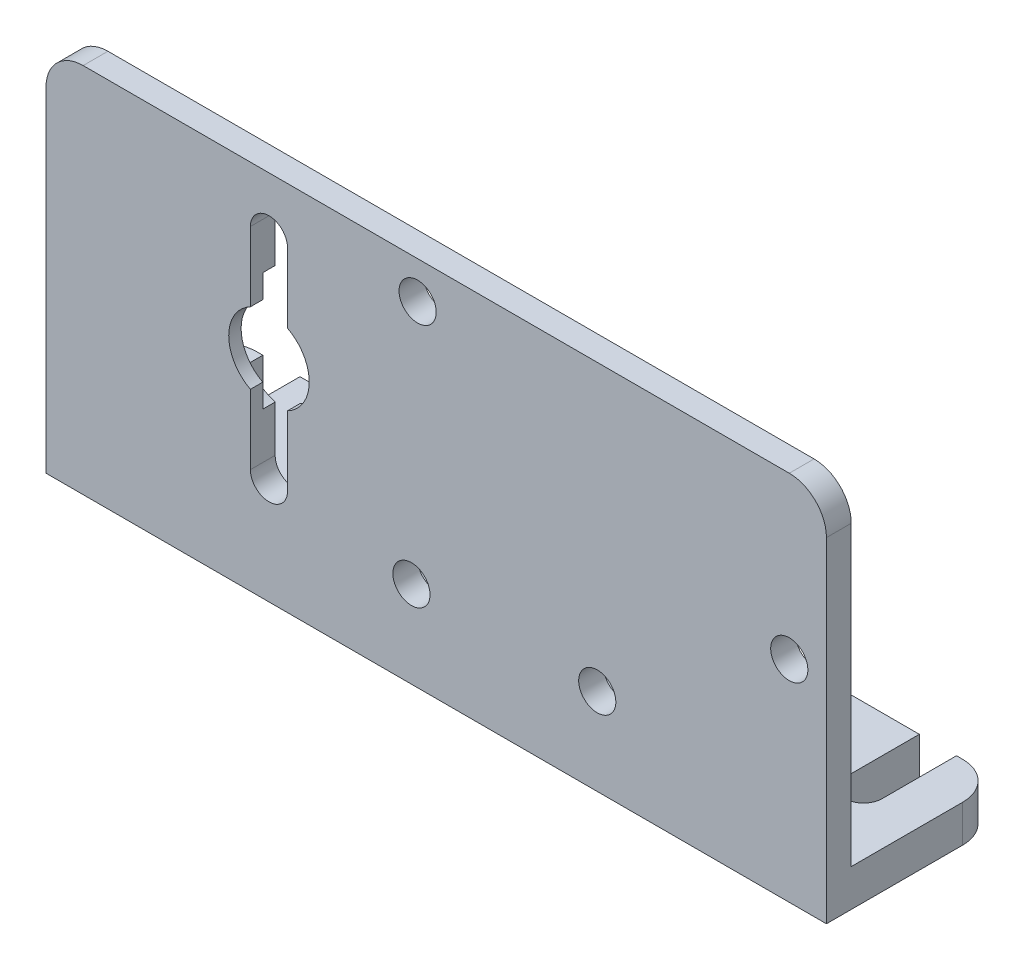
ISO-10303-21;
HEADER;
FILE_DESCRIPTION(('STEP AP214'),'2;1');
FILE_NAME('part.step','',(''),(''),'','','');
FILE_SCHEMA(('AUTOMOTIVE_DESIGN { 1 0 10303 214 1 1 1 1 }'));
ENDSEC;
DATA;
#1=APPLICATION_CONTEXT('core data for automotive mechanical design processes');
#2=APPLICATION_PROTOCOL_DEFINITION('international standard','automotive_design',2000,#1);
#3=PRODUCT_CONTEXT('',#1,'mechanical');
#4=PRODUCT('Part','Part','',(#3));
#5=PRODUCT_RELATED_PRODUCT_CATEGORY('part','',(#4));
#6=PRODUCT_DEFINITION_FORMATION('','',#4);
#7=PRODUCT_DEFINITION_CONTEXT('part definition',#1,'design');
#8=PRODUCT_DEFINITION('design','',#6,#7);
#9=PRODUCT_DEFINITION_SHAPE('','',#8);
#10=(LENGTH_UNIT() NAMED_UNIT(*) SI_UNIT(.MILLI.,.METRE.));
#11=(NAMED_UNIT(*) PLANE_ANGLE_UNIT() SI_UNIT($,.RADIAN.));
#12=(NAMED_UNIT(*) SI_UNIT($,.STERADIAN.) SOLID_ANGLE_UNIT());
#13=UNCERTAINTY_MEASURE_WITH_UNIT(LENGTH_MEASURE(1.E-05),#10,'distance_accuracy_value','');
#14=(GEOMETRIC_REPRESENTATION_CONTEXT(3) GLOBAL_UNCERTAINTY_ASSIGNED_CONTEXT((#13)) GLOBAL_UNIT_ASSIGNED_CONTEXT((#10,
#11,#12)) REPRESENTATION_CONTEXT('',''));
#15=CARTESIAN_POINT('',(0.,0.,0.));
#16=DIRECTION('',(0.,0.,1.));
#17=DIRECTION('',(1.,0.,0.));
#18=AXIS2_PLACEMENT_3D('',#15,#16,#17);
#19=CARTESIAN_POINT('',(-12.,10.5,-12.0000000000001));
#20=DIRECTION('',(1.,0.,0.));
#21=DIRECTION('',(0.,1.,0.));
#22=AXIS2_PLACEMENT_3D('',#19,#20,#21);
#23=PLANE('',#22);
#24=DIRECTION('',(0.,1.,0.));
#25=VECTOR('',#24,1.);
#26=CARTESIAN_POINT('',(-12.,10.5,1.99999999999995));
#27=LINE('',#26,#25);
#28=CARTESIAN_POINT('',(-12.,-6.49999999999998,1.99999999999995));
#29=VERTEX_POINT('',#28);
#30=CARTESIAN_POINT('',(-12.,-0.88314064866768,1.99999999999995));
#31=VERTEX_POINT('',#30);
#32=EDGE_CURVE('E274',#29,#31,#27,.T.);
#33=ORIENTED_EDGE('',*,*,#32,.T.);
#34=DIRECTION('',(0.,0.,-1.));
#35=VECTOR('',#34,1.);
#36=CARTESIAN_POINT('',(-12.,-0.88314064866768,1.99999999999995));
#37=LINE('',#36,#35);
#38=CARTESIAN_POINT('',(-12.,-0.88314064866768,0.999999999999945));
#39=VERTEX_POINT('',#38);
#40=EDGE_CURVE('E551',#31,#39,#37,.T.);
#41=ORIENTED_EDGE('',*,*,#40,.T.);
#42=DIRECTION('',(0.,-1.,0.));
#43=VECTOR('',#42,1.);
#44=CARTESIAN_POINT('',(-12.,10.5,0.999999999999945));
#45=LINE('',#44,#43);
#46=CARTESIAN_POINT('',(-12.,-2.76969600708471,0.999999999999945));
#47=VERTEX_POINT('',#46);
#48=EDGE_CURVE('E546',#39,#47,#45,.T.);
#49=ORIENTED_EDGE('',*,*,#48,.T.);
#50=DIRECTION('',(0.,0.,-1.));
#51=VECTOR('',#50,1.);
#52=CARTESIAN_POINT('',(-12.,-2.76969600708471,0.999999999999945));
#53=LINE('',#52,#51);
#54=CARTESIAN_POINT('',(-12.,-2.76969600708471,0.));
#55=VERTEX_POINT('',#54);
#56=EDGE_CURVE('E531',#55,#47,#53,.F.);
#57=ORIENTED_EDGE('',*,*,#56,.F.);
#58=DIRECTION('',(0.,-1.,0.));
#59=VECTOR('',#58,1.);
#60=CARTESIAN_POINT('',(-12.,0.,0.));
#61=LINE('',#60,#59);
#62=CARTESIAN_POINT('',(-12.,-6.49999999999998,0.));
#63=VERTEX_POINT('',#62);
#64=EDGE_CURVE('E300',#55,#63,#61,.T.);
#65=ORIENTED_EDGE('',*,*,#64,.T.);
#66=DIRECTION('',(0.,0.,1.));
#67=VECTOR('',#66,1.);
#68=CARTESIAN_POINT('',(-12.,-6.49999999999998,-12.0000000000001));
#69=LINE('',#68,#67);
#70=EDGE_CURVE('E283',#63,#29,#69,.T.);
#71=ORIENTED_EDGE('',*,*,#70,.T.);
#72=EDGE_LOOP('',(#33,#41,#49,#57,#65,#71));
#73=FACE_BOUND('',#72,.T.);
#74=ADVANCED_FACE('F39',(#73),#23,.F.);
#75=CARTESIAN_POINT('',(-15.,10.5,-12.));
#76=DIRECTION('',(-1.,0.,0.));
#77=DIRECTION('',(0.,-1.,0.));
#78=AXIS2_PLACEMENT_3D('',#75,#76,#77);
#79=PLANE('',#78);
#80=DIRECTION('',(0.,-1.,0.));
#81=VECTOR('',#80,1.);
#82=CARTESIAN_POINT('',(-15.,10.5,1.99999999999995));
#83=LINE('',#82,#81);
#84=CARTESIAN_POINT('',(-15.,10.5,1.99999999999995));
#85=VERTEX_POINT('',#84);
#86=CARTESIAN_POINT('',(-15.,4.88314064866771,1.99999999999995));
#87=VERTEX_POINT('',#86);
#88=EDGE_CURVE('E251',#85,#87,#83,.T.);
#89=ORIENTED_EDGE('',*,*,#88,.T.);
#90=DIRECTION('',(0.,0.,-1.));
#91=VECTOR('',#90,1.);
#92=CARTESIAN_POINT('',(-15.,4.88314064866771,1.99999999999995));
#93=LINE('',#92,#91);
#94=CARTESIAN_POINT('',(-15.,4.88314064866771,0.999999999999945));
#95=VERTEX_POINT('',#94);
#96=EDGE_CURVE('E234',#87,#95,#93,.T.);
#97=ORIENTED_EDGE('',*,*,#96,.T.);
#98=DIRECTION('',(0.,1.,0.));
#99=VECTOR('',#98,1.);
#100=CARTESIAN_POINT('',(-15.,10.5,0.999999999999945));
#101=LINE('',#100,#99);
#102=CARTESIAN_POINT('',(-15.,6.76969600708474,0.999999999999945));
#103=VERTEX_POINT('',#102);
#104=EDGE_CURVE('E485',#95,#103,#101,.T.);
#105=ORIENTED_EDGE('',*,*,#104,.T.);
#106=DIRECTION('',(0.,0.,-1.));
#107=VECTOR('',#106,1.);
#108=CARTESIAN_POINT('',(-15.,6.76969600708474,0.999999999999945));
#109=LINE('',#108,#107);
#110=CARTESIAN_POINT('',(-15.,6.76969600708474,0.));
#111=VERTEX_POINT('',#110);
#112=EDGE_CURVE('E48',#111,#103,#109,.F.);
#113=ORIENTED_EDGE('',*,*,#112,.F.);
#114=DIRECTION('',(0.,1.,0.));
#115=VECTOR('',#114,1.);
#116=CARTESIAN_POINT('',(-15.,0.,0.));
#117=LINE('',#116,#115);
#118=CARTESIAN_POINT('',(-15.,10.5,0.));
#119=VERTEX_POINT('',#118);
#120=EDGE_CURVE('E282',#111,#119,#117,.T.);
#121=ORIENTED_EDGE('',*,*,#120,.T.);
#122=DIRECTION('',(0.,0.,1.));
#123=VECTOR('',#122,1.);
#124=CARTESIAN_POINT('',(-15.,10.5,-12.));
#125=LINE('',#124,#123);
#126=EDGE_CURVE('E260',#119,#85,#125,.T.);
#127=ORIENTED_EDGE('',*,*,#126,.T.);
#128=EDGE_LOOP('',(#89,#97,#105,#113,#121,#127));
#129=FACE_BOUND('',#128,.T.);
#130=ADVANCED_FACE('F258',(#129),#79,.F.);
#131=CARTESIAN_POINT('',(-12.,6.76969600708474,0.999999999999945));
#132=VERTEX_POINT('',#131);
#133=CARTESIAN_POINT('',(-12.,4.88314064866771,0.999999999999945));
#134=VERTEX_POINT('',#133);
#135=EDGE_CURVE('E541',#132,#134,#45,.T.);
#136=ORIENTED_EDGE('',*,*,#135,.T.);
#137=DIRECTION('',(0.,0.,-1.));
#138=VECTOR('',#137,1.);
#139=CARTESIAN_POINT('',(-12.,4.88314064866771,1.99999999999995));
#140=LINE('',#139,#138);
#141=CARTESIAN_POINT('',(-12.,4.88314064866771,1.99999999999995));
#142=VERTEX_POINT('',#141);
#143=EDGE_CURVE('E63',#134,#142,#140,.F.);
#144=ORIENTED_EDGE('',*,*,#143,.T.);
#145=CARTESIAN_POINT('',(-12.,10.5,1.99999999999995));
#146=VERTEX_POINT('',#145);
#147=EDGE_CURVE('E268',#142,#146,#27,.T.);
#148=ORIENTED_EDGE('',*,*,#147,.T.);
#149=DIRECTION('',(0.,0.,1.));
#150=VECTOR('',#149,1.);
#151=CARTESIAN_POINT('',(-12.,10.5,-12.0000000000001));
#152=LINE('',#151,#150);
#153=CARTESIAN_POINT('',(-12.,10.5,0.));
#154=VERTEX_POINT('',#153);
#155=EDGE_CURVE('E278',#154,#146,#152,.T.);
#156=ORIENTED_EDGE('',*,*,#155,.F.);
#157=CARTESIAN_POINT('',(-12.,6.76969600708474,0.));
#158=VERTEX_POINT('',#157);
#159=EDGE_CURVE('E301',#154,#158,#61,.T.);
#160=ORIENTED_EDGE('',*,*,#159,.T.);
#161=DIRECTION('',(0.,0.,-1.));
#162=VECTOR('',#161,1.);
#163=CARTESIAN_POINT('',(-12.,6.76969600708474,0.999999999999945));
#164=LINE('',#163,#162);
#165=EDGE_CURVE('E535',#132,#158,#164,.T.);
#166=ORIENTED_EDGE('',*,*,#165,.F.);
#167=EDGE_LOOP('',(#136,#144,#148,#156,#160,#166));
#168=FACE_BOUND('',#167,.T.);
#169=ADVANCED_FACE('F526',(#168),#23,.F.);
#170=CARTESIAN_POINT('',(-15.,-2.76969600708471,0.999999999999945));
#171=VERTEX_POINT('',#170);
#172=CARTESIAN_POINT('',(-15.,-0.88314064866768,0.999999999999945));
#173=VERTEX_POINT('',#172);
#174=EDGE_CURVE('E486',#171,#173,#101,.T.);
#175=ORIENTED_EDGE('',*,*,#174,.T.);
#176=DIRECTION('',(0.,0.,-1.));
#177=VECTOR('',#176,1.);
#178=CARTESIAN_POINT('',(-15.,-0.88314064866768,1.99999999999995));
#179=LINE('',#178,#177);
#180=CARTESIAN_POINT('',(-15.,-0.88314064866768,1.99999999999995));
#181=VERTEX_POINT('',#180);
#182=EDGE_CURVE('E55',#173,#181,#179,.F.);
#183=ORIENTED_EDGE('',*,*,#182,.T.);
#184=CARTESIAN_POINT('',(-15.,-6.49999999999998,1.99999999999995));
#185=VERTEX_POINT('',#184);
#186=EDGE_CURVE('E253',#181,#185,#83,.T.);
#187=ORIENTED_EDGE('',*,*,#186,.T.);
#188=DIRECTION('',(0.,0.,1.));
#189=VECTOR('',#188,1.);
#190=CARTESIAN_POINT('',(-15.,-6.49999999999998,-12.));
#191=LINE('',#190,#189);
#192=CARTESIAN_POINT('',(-15.,-6.49999999999998,0.));
#193=VERTEX_POINT('',#192);
#194=EDGE_CURVE('E286',#193,#185,#191,.T.);
#195=ORIENTED_EDGE('',*,*,#194,.F.);
#196=CARTESIAN_POINT('',(-15.,-2.76969600708471,0.));
#197=VERTEX_POINT('',#196);
#198=EDGE_CURVE('E292',#193,#197,#117,.T.);
#199=ORIENTED_EDGE('',*,*,#198,.T.);
#200=DIRECTION('',(0.,0.,-1.));
#201=VECTOR('',#200,1.);
#202=CARTESIAN_POINT('',(-15.,-2.76969600708471,0.999999999999945));
#203=LINE('',#202,#201);
#204=EDGE_CURVE('E490',#171,#197,#203,.T.);
#205=ORIENTED_EDGE('',*,*,#204,.F.);
#206=EDGE_LOOP('',(#175,#183,#187,#195,#199,#205));
#207=FACE_BOUND('',#206,.T.);
#208=ADVANCED_FACE('F632',(#207),#79,.F.);
#209=CARTESIAN_POINT('',(0.,0.,-12.));
#210=DIRECTION('',(0.,0.,-1.));
#211=DIRECTION('',(-1.,0.,0.));
#212=AXIS2_PLACEMENT_3D('',#209,#210,#211);
#213=PLANE('',#212);
#214=DIRECTION('',(0.,1.,0.));
#215=VECTOR('',#214,1.);
#216=CARTESIAN_POINT('',(25.,0.,-12.0000000000001));
#217=LINE('',#216,#215);
#218=CARTESIAN_POINT('',(25.,-15.,-12.0000000000001));
#219=VERTEX_POINT('',#218);
#220=CARTESIAN_POINT('',(25.,-12.,-12.0000000000001));
#221=VERTEX_POINT('',#220);
#222=EDGE_CURVE('E430',#219,#221,#217,.T.);
#223=ORIENTED_EDGE('',*,*,#222,.F.);
#224=DIRECTION('',(1.,0.,0.));
#225=VECTOR('',#224,1.);
#226=CARTESIAN_POINT('',(-31.5,-15.,-12.));
#227=LINE('',#226,#225);
#228=CARTESIAN_POINT('',(-25.,-15.,-12.));
#229=VERTEX_POINT('',#228);
#230=EDGE_CURVE('E372',#229,#219,#227,.T.);
#231=ORIENTED_EDGE('',*,*,#230,.F.);
#232=DIRECTION('',(0.,-1.,0.));
#233=VECTOR('',#232,1.);
#234=CARTESIAN_POINT('',(-25.,0.,-12.));
#235=LINE('',#234,#233);
#236=CARTESIAN_POINT('',(-25.,-12.,-12.));
#237=VERTEX_POINT('',#236);
#238=EDGE_CURVE('E421',#237,#229,#235,.T.);
#239=ORIENTED_EDGE('',*,*,#238,.F.);
#240=DIRECTION('',(-1.,0.,0.));
#241=VECTOR('',#240,1.);
#242=CARTESIAN_POINT('',(-31.5,-12.,-12.));
#243=LINE('',#242,#241);
#244=EDGE_CURVE('E378',#221,#237,#243,.T.);
#245=ORIENTED_EDGE('',*,*,#244,.F.);
#246=EDGE_LOOP('',(#223,#231,#239,#245));
#247=FACE_BOUND('',#246,.T.);
#248=ADVANCED_FACE('F639',(#247),#213,.T.);
#249=CARTESIAN_POINT('',(-28.5,-15.,-12.));
#250=VERTEX_POINT('',#249);
#251=CARTESIAN_POINT('',(-28.,-15.,-12.));
#252=VERTEX_POINT('',#251);
#253=EDGE_CURVE('E368',#250,#252,#227,.T.);
#254=ORIENTED_EDGE('',*,*,#253,.F.);
#255=DIRECTION('',(0.,-1.,0.));
#256=VECTOR('',#255,1.);
#257=CARTESIAN_POINT('',(-28.5,-12.,-12.));
#258=LINE('',#257,#256);
#259=CARTESIAN_POINT('',(-28.5,-12.,-12.));
#260=VERTEX_POINT('',#259);
#261=EDGE_CURVE('E473',#250,#260,#258,.F.);
#262=ORIENTED_EDGE('',*,*,#261,.T.);
#263=CARTESIAN_POINT('',(-28.,-12.,-12.));
#264=VERTEX_POINT('',#263);
#265=EDGE_CURVE('E371',#264,#260,#243,.T.);
#266=ORIENTED_EDGE('',*,*,#265,.F.);
#267=DIRECTION('',(0.,1.,0.));
#268=VECTOR('',#267,1.);
#269=CARTESIAN_POINT('',(-28.,0.,-12.));
#270=LINE('',#269,#268);
#271=EDGE_CURVE('E424',#252,#264,#270,.T.);
#272=ORIENTED_EDGE('',*,*,#271,.F.);
#273=EDGE_LOOP('',(#254,#262,#266,#272));
#274=FACE_BOUND('',#273,.T.);
#275=ADVANCED_FACE('F644',(#274),#213,.T.);
#276=CARTESIAN_POINT('',(0.,0.,0.));
#277=DIRECTION('',(0.,0.,-1.));
#278=DIRECTION('',(-1.,0.,0.));
#279=AXIS2_PLACEMENT_3D('',#276,#277,#278);
#280=PLANE('',#279);
#281=CARTESIAN_POINT('',(28.5,2.,0.));
#282=DIRECTION('',(0.,0.,-1.));
#283=DIRECTION('',(-1.,0.,0.));
#284=AXIS2_PLACEMENT_3D('',#281,#282,#283);
#285=CIRCLE('',#284,1.5);
#286=CARTESIAN_POINT('',(27.,2.,0.));
#287=VERTEX_POINT('',#286);
#288=EDGE_CURVE('E563',#287,#287,#285,.T.);
#289=ORIENTED_EDGE('',*,*,#288,.F.);
#290=EDGE_LOOP('',(#289));
#291=FACE_BOUND('',#290,.T.);
#292=CARTESIAN_POINT('',(-1.5,12.,0.));
#293=DIRECTION('',(0.,0.,-1.));
#294=DIRECTION('',(-1.,0.,0.));
#295=AXIS2_PLACEMENT_3D('',#292,#293,#294);
#296=CIRCLE('',#295,1.5);
#297=CARTESIAN_POINT('',(-3.,12.,0.));
#298=VERTEX_POINT('',#297);
#299=EDGE_CURVE('E568',#298,#298,#296,.T.);
#300=ORIENTED_EDGE('',*,*,#299,.F.);
#301=EDGE_LOOP('',(#300));
#302=FACE_BOUND('',#301,.T.);
#303=CARTESIAN_POINT('',(-2.,-8.00000000000001,0.));
#304=DIRECTION('',(0.,0.,-1.));
#305=DIRECTION('',(-1.,0.,0.));
#306=AXIS2_PLACEMENT_3D('',#303,#304,#305);
#307=CIRCLE('',#306,1.5);
#308=CARTESIAN_POINT('',(-3.5,-8.00000000000001,0.));
#309=VERTEX_POINT('',#308);
#310=EDGE_CURVE('E572',#309,#309,#307,.T.);
#311=ORIENTED_EDGE('',*,*,#310,.F.);
#312=EDGE_LOOP('',(#311));
#313=FACE_BOUND('',#312,.T.);
#314=CARTESIAN_POINT('',(13.,-8.00000000000001,0.));
#315=DIRECTION('',(0.,0.,-1.));
#316=DIRECTION('',(-1.,0.,0.));
#317=AXIS2_PLACEMENT_3D('',#314,#315,#316);
#318=CIRCLE('',#317,1.5);
#319=CARTESIAN_POINT('',(11.5,-8.00000000000001,0.));
#320=VERTEX_POINT('',#319);
#321=EDGE_CURVE('E576',#320,#320,#318,.T.);
#322=ORIENTED_EDGE('',*,*,#321,.F.);
#323=EDGE_LOOP('',(#322));
#324=FACE_BOUND('',#323,.T.);
#325=ORIENTED_EDGE('',*,*,#64,.F.);
#326=CARTESIAN_POINT('',(-13.5,2.,0.));
#327=DIRECTION('',(0.,0.,1.));
#328=DIRECTION('',(1.,0.,0.));
#329=AXIS2_PLACEMENT_3D('',#326,#327,#328);
#330=CIRCLE('',#329,5.);
#331=EDGE_CURVE('E547',#55,#158,#330,.T.);
#332=ORIENTED_EDGE('',*,*,#331,.T.);
#333=ORIENTED_EDGE('',*,*,#159,.F.);
#334=CARTESIAN_POINT('',(-13.5,10.5,0.));
#335=DIRECTION('',(0.,0.,-1.));
#336=DIRECTION('',(-1.,0.,0.));
#337=AXIS2_PLACEMENT_3D('',#334,#335,#336);
#338=CIRCLE('',#337,1.5);
#339=EDGE_CURVE('E305',#119,#154,#338,.T.);
#340=ORIENTED_EDGE('',*,*,#339,.F.);
#341=ORIENTED_EDGE('',*,*,#120,.F.);
#342=EDGE_CURVE('E503',#111,#197,#330,.T.);
#343=ORIENTED_EDGE('',*,*,#342,.T.);
#344=ORIENTED_EDGE('',*,*,#198,.F.);
#345=CARTESIAN_POINT('',(-13.5,-6.49999999999998,0.));
#346=DIRECTION('',(0.,0.,-1.));
#347=DIRECTION('',(-1.,0.,0.));
#348=AXIS2_PLACEMENT_3D('',#345,#346,#347);
#349=CIRCLE('',#348,1.5);
#350=EDGE_CURVE('E296',#63,#193,#349,.T.);
#351=ORIENTED_EDGE('',*,*,#350,.F.);
#352=EDGE_LOOP('',(#325,#332,#333,#340,#341,#343,#344,#351));
#353=FACE_BOUND('',#352,.T.);
#354=DIRECTION('',(0.,-1.,0.));
#355=VECTOR('',#354,1.);
#356=CARTESIAN_POINT('',(-31.5,15.,0.));
#357=LINE('',#356,#355);
#358=CARTESIAN_POINT('',(-31.5,12.,0.));
#359=VERTEX_POINT('',#358);
#360=CARTESIAN_POINT('',(-31.5,-12.,0.));
#361=VERTEX_POINT('',#360);
#362=EDGE_CURVE('E385',#359,#361,#357,.T.);
#363=ORIENTED_EDGE('',*,*,#362,.F.);
#364=CARTESIAN_POINT('',(-28.5,12.,0.));
#365=DIRECTION('',(0.,0.,-1.));
#366=DIRECTION('',(-1.,0.,0.));
#367=AXIS2_PLACEMENT_3D('',#364,#365,#366);
#368=CIRCLE('',#367,3.);
#369=CARTESIAN_POINT('',(-28.5,15.,0.));
#370=VERTEX_POINT('',#369);
#371=EDGE_CURVE('E444',#359,#370,#368,.T.);
#372=ORIENTED_EDGE('',*,*,#371,.T.);
#373=DIRECTION('',(-1.,0.,0.));
#374=VECTOR('',#373,1.);
#375=CARTESIAN_POINT('',(31.5,15.,0.));
#376=LINE('',#375,#374);
#377=CARTESIAN_POINT('',(28.5,15.,0.));
#378=VERTEX_POINT('',#377);
#379=EDGE_CURVE('E392',#378,#370,#376,.T.);
#380=ORIENTED_EDGE('',*,*,#379,.F.);
#381=CARTESIAN_POINT('',(28.5,12.,0.));
#382=DIRECTION('',(0.,0.,-1.));
#383=DIRECTION('',(-1.,0.,0.));
#384=AXIS2_PLACEMENT_3D('',#381,#382,#383);
#385=CIRCLE('',#384,3.);
#386=CARTESIAN_POINT('',(31.5,12.,0.));
#387=VERTEX_POINT('',#386);
#388=EDGE_CURVE('E441',#378,#387,#385,.T.);
#389=ORIENTED_EDGE('',*,*,#388,.T.);
#390=DIRECTION('',(0.,1.,0.));
#391=VECTOR('',#390,1.);
#392=CARTESIAN_POINT('',(31.5,15.,0.));
#393=LINE('',#392,#391);
#394=CARTESIAN_POINT('',(31.5,-12.,0.));
#395=VERTEX_POINT('',#394);
#396=EDGE_CURVE('E407',#395,#387,#393,.T.);
#397=ORIENTED_EDGE('',*,*,#396,.F.);
#398=DIRECTION('',(-1.,0.,0.));
#399=VECTOR('',#398,1.);
#400=CARTESIAN_POINT('',(-31.5,-12.,0.));
#401=LINE('',#400,#399);
#402=EDGE_CURVE('E338',#395,#361,#401,.T.);
#403=ORIENTED_EDGE('',*,*,#402,.T.);
#404=EDGE_LOOP('',(#363,#372,#380,#389,#397,#403));
#405=FACE_BOUND('',#404,.T.);
#406=ADVANCED_FACE('F508',(#291,#302,#313,#324,#353,#405),#280,.T.);
#407=CARTESIAN_POINT('',(-31.5,15.,2.));
#408=DIRECTION('',(1.,0.,0.));
#409=DIRECTION('',(0.,0.,-1.));
#410=AXIS2_PLACEMENT_3D('',#407,#408,#409);
#411=PLANE('',#410);
#412=DIRECTION('',(0.,-1.,0.));
#413=VECTOR('',#412,1.);
#414=CARTESIAN_POINT('',(-31.5,15.,2.));
#415=LINE('',#414,#413);
#416=CARTESIAN_POINT('',(-31.5,12.,2.));
#417=VERTEX_POINT('',#416);
#418=CARTESIAN_POINT('',(-31.5,-15.,2.));
#419=VERTEX_POINT('',#418);
#420=EDGE_CURVE('E388',#417,#419,#415,.T.);
#421=ORIENTED_EDGE('',*,*,#420,.F.);
#422=DIRECTION('',(0.,0.,-1.));
#423=VECTOR('',#422,1.);
#424=CARTESIAN_POINT('',(-31.5,12.,2.));
#425=LINE('',#424,#423);
#426=EDGE_CURVE('E437',#417,#359,#425,.T.);
#427=ORIENTED_EDGE('',*,*,#426,.T.);
#428=ORIENTED_EDGE('',*,*,#362,.T.);
#429=DIRECTION('',(0.,0.,1.));
#430=VECTOR('',#429,1.);
#431=CARTESIAN_POINT('',(-31.5,-12.,-12.));
#432=LINE('',#431,#430);
#433=CARTESIAN_POINT('',(-31.5,-12.,-9.00000000000001));
#434=VERTEX_POINT('',#433);
#435=EDGE_CURVE('E382',#434,#361,#432,.T.);
#436=ORIENTED_EDGE('',*,*,#435,.F.);
#437=DIRECTION('',(0.,-1.,0.));
#438=VECTOR('',#437,1.);
#439=CARTESIAN_POINT('',(-31.5,-15.,-9.00000000000001));
#440=LINE('',#439,#438);
#441=CARTESIAN_POINT('',(-31.5,-15.,-9.00000000000001));
#442=VERTEX_POINT('',#441);
#443=EDGE_CURVE('E433',#434,#442,#440,.T.);
#444=ORIENTED_EDGE('',*,*,#443,.T.);
#445=DIRECTION('',(0.,0.,-1.));
#446=VECTOR('',#445,1.);
#447=CARTESIAN_POINT('',(-31.5,-15.,2.));
#448=LINE('',#447,#446);
#449=EDGE_CURVE('E417',#419,#442,#448,.T.);
#450=ORIENTED_EDGE('',*,*,#449,.F.);
#451=EDGE_LOOP('',(#421,#427,#428,#436,#444,#450));
#452=FACE_BOUND('',#451,.T.);
#453=ADVANCED_FACE('F684',(#452),#411,.F.);
#454=CARTESIAN_POINT('',(31.5,-15.,2.));
#455=DIRECTION('',(0.,1.,0.));
#456=DIRECTION('',(-1.,0.,0.));
#457=AXIS2_PLACEMENT_3D('',#454,#455,#456);
#458=PLANE('',#457);
#459=ORIENTED_EDGE('',*,*,#449,.T.);
#460=CARTESIAN_POINT('',(-28.5,-15.,-9.00000000000001));
#461=DIRECTION('',(0.,1.,0.));
#462=DIRECTION('',(-1.,0.,0.));
#463=AXIS2_PLACEMENT_3D('',#460,#461,#462);
#464=CIRCLE('',#463,3.);
#465=EDGE_CURVE('E470',#442,#250,#464,.F.);
#466=ORIENTED_EDGE('',*,*,#465,.T.);
#467=ORIENTED_EDGE('',*,*,#253,.T.);
#468=DIRECTION('',(0.,0.,1.));
#469=VECTOR('',#468,1.);
#470=CARTESIAN_POINT('',(-28.,-15.,-6.00000000000001));
#471=LINE('',#470,#469);
#472=CARTESIAN_POINT('',(-28.,-15.,-6.00000000000001));
#473=VERTEX_POINT('',#472);
#474=EDGE_CURVE('E350',#252,#473,#471,.T.);
#475=ORIENTED_EDGE('',*,*,#474,.T.);
#476=CARTESIAN_POINT('',(-26.5,-15.,-5.99999999999999));
#477=DIRECTION('',(0.,1.,0.));
#478=DIRECTION('',(0.,0.,-1.));
#479=AXIS2_PLACEMENT_3D('',#476,#477,#478);
#480=CIRCLE('',#479,1.49999999999999);
#481=CARTESIAN_POINT('',(-25.,-15.,-6.00000000000001));
#482=VERTEX_POINT('',#481);
#483=EDGE_CURVE('E341',#473,#482,#480,.T.);
#484=ORIENTED_EDGE('',*,*,#483,.T.);
#485=DIRECTION('',(0.,0.,-1.));
#486=VECTOR('',#485,1.);
#487=CARTESIAN_POINT('',(-25.,-15.,-6.00000000000001));
#488=LINE('',#487,#486);
#489=EDGE_CURVE('E345',#482,#229,#488,.T.);
#490=ORIENTED_EDGE('',*,*,#489,.T.);
#491=ORIENTED_EDGE('',*,*,#230,.T.);
#492=DIRECTION('',(0.,0.,1.));
#493=VECTOR('',#492,1.);
#494=CARTESIAN_POINT('',(25.,-15.,-6.00000000000005));
#495=LINE('',#494,#493);
#496=CARTESIAN_POINT('',(25.,-15.,-6.00000000000005));
#497=VERTEX_POINT('',#496);
#498=EDGE_CURVE('E318',#219,#497,#495,.T.);
#499=ORIENTED_EDGE('',*,*,#498,.T.);
#500=CARTESIAN_POINT('',(26.5,-15.,-5.99999999999999));
#501=DIRECTION('',(0.,1.,0.));
#502=DIRECTION('',(0.,0.,1.));
#503=AXIS2_PLACEMENT_3D('',#500,#501,#502);
#504=CIRCLE('',#503,1.49999999999999);
#505=CARTESIAN_POINT('',(28.,-15.,-5.99999999999999));
#506=VERTEX_POINT('',#505);
#507=EDGE_CURVE('E309',#497,#506,#504,.T.);
#508=ORIENTED_EDGE('',*,*,#507,.T.);
#509=DIRECTION('',(0.,0.,-1.));
#510=VECTOR('',#509,1.);
#511=CARTESIAN_POINT('',(28.,-15.,-5.99999999999999));
#512=LINE('',#511,#510);
#513=CARTESIAN_POINT('',(28.,-15.,-12.));
#514=VERTEX_POINT('',#513);
#515=EDGE_CURVE('E313',#506,#514,#512,.T.);
#516=ORIENTED_EDGE('',*,*,#515,.T.);
#517=CARTESIAN_POINT('',(28.5,-15.,-12.));
#518=VERTEX_POINT('',#517);
#519=EDGE_CURVE('E373',#514,#518,#227,.T.);
#520=ORIENTED_EDGE('',*,*,#519,.T.);
#521=CARTESIAN_POINT('',(28.5,-15.,-8.99999999999999));
#522=DIRECTION('',(0.,1.,0.));
#523=DIRECTION('',(-1.,0.,0.));
#524=AXIS2_PLACEMENT_3D('',#521,#522,#523);
#525=CIRCLE('',#524,3.);
#526=CARTESIAN_POINT('',(31.5,-15.,-9.00000000000001));
#527=VERTEX_POINT('',#526);
#528=EDGE_CURVE('E467',#518,#527,#525,.F.);
#529=ORIENTED_EDGE('',*,*,#528,.T.);
#530=DIRECTION('',(0.,0.,-1.));
#531=VECTOR('',#530,1.);
#532=CARTESIAN_POINT('',(31.5,-15.,2.));
#533=LINE('',#532,#531);
#534=CARTESIAN_POINT('',(31.5,-15.,2.));
#535=VERTEX_POINT('',#534);
#536=EDGE_CURVE('E403',#535,#527,#533,.T.);
#537=ORIENTED_EDGE('',*,*,#536,.F.);
#538=DIRECTION('',(1.,0.,0.));
#539=VECTOR('',#538,1.);
#540=CARTESIAN_POINT('',(31.5,-15.,2.));
#541=LINE('',#540,#539);
#542=EDGE_CURVE('E391',#419,#535,#541,.T.);
#543=ORIENTED_EDGE('',*,*,#542,.F.);
#544=EDGE_LOOP('',(#459,#466,#467,#475,#484,#490,#491,#499,#508,#516,#520,#529,#537,#543));
#545=FACE_BOUND('',#544,.T.);
#546=ADVANCED_FACE('F692',(#545),#458,.F.);
#547=CARTESIAN_POINT('',(31.5,15.,2.));
#548=DIRECTION('',(-1.,0.,0.));
#549=DIRECTION('',(0.,0.,1.));
#550=AXIS2_PLACEMENT_3D('',#547,#548,#549);
#551=PLANE('',#550);
#552=ORIENTED_EDGE('',*,*,#396,.T.);
#553=DIRECTION('',(0.,0.,-1.));
#554=VECTOR('',#553,1.);
#555=CARTESIAN_POINT('',(31.5,12.,2.));
#556=LINE('',#555,#554);
#557=CARTESIAN_POINT('',(31.5,12.,2.));
#558=VERTEX_POINT('',#557);
#559=EDGE_CURVE('E464',#387,#558,#556,.F.);
#560=ORIENTED_EDGE('',*,*,#559,.T.);
#561=DIRECTION('',(0.,1.,0.));
#562=VECTOR('',#561,1.);
#563=CARTESIAN_POINT('',(31.5,15.,2.));
#564=LINE('',#563,#562);
#565=EDGE_CURVE('E395',#535,#558,#564,.T.);
#566=ORIENTED_EDGE('',*,*,#565,.F.);
#567=ORIENTED_EDGE('',*,*,#536,.T.);
#568=DIRECTION('',(0.,1.,0.));
#569=VECTOR('',#568,1.);
#570=CARTESIAN_POINT('',(31.5,-12.,-9.00000000000001));
#571=LINE('',#570,#569);
#572=CARTESIAN_POINT('',(31.5,-12.,-9.00000000000001));
#573=VERTEX_POINT('',#572);
#574=EDGE_CURVE('E460',#527,#573,#571,.T.);
#575=ORIENTED_EDGE('',*,*,#574,.T.);
#576=DIRECTION('',(0.,0.,1.));
#577=VECTOR('',#576,1.);
#578=CARTESIAN_POINT('',(31.5,-12.,-12.));
#579=LINE('',#578,#577);
#580=EDGE_CURVE('E377',#573,#395,#579,.T.);
#581=ORIENTED_EDGE('',*,*,#580,.T.);
#582=EDGE_LOOP('',(#552,#560,#566,#567,#575,#581));
#583=FACE_BOUND('',#582,.T.);
#584=ADVANCED_FACE('F688',(#583),#551,.F.);
#585=CARTESIAN_POINT('',(31.5,15.,2.));
#586=DIRECTION('',(0.,-1.,0.));
#587=DIRECTION('',(1.,0.,0.));
#588=AXIS2_PLACEMENT_3D('',#585,#586,#587);
#589=PLANE('',#588);
#590=ORIENTED_EDGE('',*,*,#379,.T.);
#591=DIRECTION('',(0.,0.,-1.));
#592=VECTOR('',#591,1.);
#593=CARTESIAN_POINT('',(-28.5,15.,2.));
#594=LINE('',#593,#592);
#595=CARTESIAN_POINT('',(-28.5,15.,2.));
#596=VERTEX_POINT('',#595);
#597=EDGE_CURVE('E451',#370,#596,#594,.F.);
#598=ORIENTED_EDGE('',*,*,#597,.T.);
#599=DIRECTION('',(-1.,0.,0.));
#600=VECTOR('',#599,1.);
#601=CARTESIAN_POINT('',(31.5,15.,2.));
#602=LINE('',#601,#600);
#603=CARTESIAN_POINT('',(28.5,15.,2.));
#604=VERTEX_POINT('',#603);
#605=EDGE_CURVE('E399',#604,#596,#602,.T.);
#606=ORIENTED_EDGE('',*,*,#605,.F.);
#607=DIRECTION('',(0.,0.,-1.));
#608=VECTOR('',#607,1.);
#609=CARTESIAN_POINT('',(28.5,15.,2.));
#610=LINE('',#609,#608);
#611=EDGE_CURVE('E447',#604,#378,#610,.T.);
#612=ORIENTED_EDGE('',*,*,#611,.T.);
#613=EDGE_LOOP('',(#590,#598,#606,#612));
#614=FACE_BOUND('',#613,.T.);
#615=ADVANCED_FACE('F603',(#614),#589,.F.);
#616=CARTESIAN_POINT('',(0.,0.,2.));
#617=DIRECTION('',(0.,0.,-1.));
#618=DIRECTION('',(-1.,0.,0.));
#619=AXIS2_PLACEMENT_3D('',#616,#617,#618);
#620=PLANE('',#619);
#621=CARTESIAN_POINT('',(28.5,2.,2.));
#622=DIRECTION('',(0.,0.,1.));
#623=DIRECTION('',(1.,0.,0.));
#624=AXIS2_PLACEMENT_3D('',#621,#622,#623);
#625=CIRCLE('',#624,1.5);
#626=CARTESIAN_POINT('',(30.,2.,2.));
#627=VERTEX_POINT('',#626);
#628=EDGE_CURVE('E580',#627,#627,#625,.T.);
#629=ORIENTED_EDGE('',*,*,#628,.F.);
#630=EDGE_LOOP('',(#629));
#631=FACE_BOUND('',#630,.T.);
#632=CARTESIAN_POINT('',(-1.5,12.,2.));
#633=DIRECTION('',(0.,0.,1.));
#634=DIRECTION('',(1.,0.,0.));
#635=AXIS2_PLACEMENT_3D('',#632,#633,#634);
#636=CIRCLE('',#635,1.5);
#637=CARTESIAN_POINT('',(0.,12.,2.));
#638=VERTEX_POINT('',#637);
#639=EDGE_CURVE('E589',#638,#638,#636,.T.);
#640=ORIENTED_EDGE('',*,*,#639,.F.);
#641=EDGE_LOOP('',(#640));
#642=FACE_BOUND('',#641,.T.);
#643=CARTESIAN_POINT('',(-2.,-8.00000000000001,2.));
#644=DIRECTION('',(0.,0.,1.));
#645=DIRECTION('',(1.,0.,0.));
#646=AXIS2_PLACEMENT_3D('',#643,#644,#645);
#647=CIRCLE('',#646,1.5);
#648=CARTESIAN_POINT('',(-0.500000000000002,-8.00000000000001,2.));
#649=VERTEX_POINT('',#648);
#650=EDGE_CURVE('E585',#649,#649,#647,.T.);
#651=ORIENTED_EDGE('',*,*,#650,.F.);
#652=EDGE_LOOP('',(#651));
#653=FACE_BOUND('',#652,.T.);
#654=CARTESIAN_POINT('',(13.,-8.00000000000001,1.99999999999999));
#655=DIRECTION('',(0.,0.,1.));
#656=DIRECTION('',(1.,0.,0.));
#657=AXIS2_PLACEMENT_3D('',#654,#655,#656);
#658=CIRCLE('',#657,1.5);
#659=CARTESIAN_POINT('',(14.5,-8.00000000000001,1.99999999999999));
#660=VERTEX_POINT('',#659);
#661=EDGE_CURVE('E581',#660,#660,#658,.T.);
#662=ORIENTED_EDGE('',*,*,#661,.F.);
#663=EDGE_LOOP('',(#662));
#664=FACE_BOUND('',#663,.T.);
#665=ORIENTED_EDGE('',*,*,#147,.F.);
#666=CARTESIAN_POINT('',(-13.5,2.,1.99999999999995));
#667=DIRECTION('',(0.,0.,-1.));
#668=DIRECTION('',(-1.,0.,0.));
#669=AXIS2_PLACEMENT_3D('',#666,#667,#668);
#670=CIRCLE('',#669,3.25);
#671=EDGE_CURVE('E255',#142,#31,#670,.T.);
#672=ORIENTED_EDGE('',*,*,#671,.T.);
#673=ORIENTED_EDGE('',*,*,#32,.F.);
#674=CARTESIAN_POINT('',(-13.5,-6.49999999999998,1.99999999999995));
#675=DIRECTION('',(0.,0.,1.));
#676=DIRECTION('',(1.,0.,0.));
#677=AXIS2_PLACEMENT_3D('',#674,#675,#676);
#678=CIRCLE('',#677,1.5);
#679=EDGE_CURVE('E262',#185,#29,#678,.T.);
#680=ORIENTED_EDGE('',*,*,#679,.F.);
#681=ORIENTED_EDGE('',*,*,#186,.F.);
#682=EDGE_CURVE('E237',#181,#87,#670,.T.);
#683=ORIENTED_EDGE('',*,*,#682,.T.);
#684=ORIENTED_EDGE('',*,*,#88,.F.);
#685=CARTESIAN_POINT('',(-13.5,10.5,1.99999999999995));
#686=DIRECTION('',(0.,0.,1.));
#687=DIRECTION('',(1.,0.,0.));
#688=AXIS2_PLACEMENT_3D('',#685,#686,#687);
#689=CIRCLE('',#688,1.5);
#690=EDGE_CURVE('E270',#146,#85,#689,.T.);
#691=ORIENTED_EDGE('',*,*,#690,.F.);
#692=EDGE_LOOP('',(#665,#672,#673,#680,#681,#683,#684,#691));
#693=FACE_BOUND('',#692,.T.);
#694=ORIENTED_EDGE('',*,*,#605,.T.);
#695=CARTESIAN_POINT('',(-28.5,12.,2.));
#696=DIRECTION('',(0.,0.,-1.));
#697=DIRECTION('',(-1.,0.,0.));
#698=AXIS2_PLACEMENT_3D('',#695,#696,#697);
#699=CIRCLE('',#698,3.);
#700=EDGE_CURVE('E457',#596,#417,#699,.F.);
#701=ORIENTED_EDGE('',*,*,#700,.T.);
#702=ORIENTED_EDGE('',*,*,#420,.T.);
#703=ORIENTED_EDGE('',*,*,#542,.T.);
#704=ORIENTED_EDGE('',*,*,#565,.T.);
#705=CARTESIAN_POINT('',(28.5,12.,2.));
#706=DIRECTION('',(0.,0.,-1.));
#707=DIRECTION('',(-1.,0.,0.));
#708=AXIS2_PLACEMENT_3D('',#705,#706,#707);
#709=CIRCLE('',#708,3.);
#710=EDGE_CURVE('E454',#558,#604,#709,.F.);
#711=ORIENTED_EDGE('',*,*,#710,.T.);
#712=EDGE_LOOP('',(#694,#701,#702,#703,#704,#711));
#713=FACE_BOUND('',#712,.T.);
#714=ADVANCED_FACE('F248',(#631,#642,#653,#664,#693,#713),#620,.F.);
#715=CARTESIAN_POINT('',(-31.5,-12.,-12.));
#716=DIRECTION('',(0.,1.,0.));
#717=DIRECTION('',(0.,0.,1.));
#718=AXIS2_PLACEMENT_3D('',#715,#716,#717);
#719=PLANE('',#718);
#720=ORIENTED_EDGE('',*,*,#265,.T.);
#721=CARTESIAN_POINT('',(-28.5,-12.,-9.00000000000001));
#722=DIRECTION('',(0.,1.,0.));
#723=DIRECTION('',(0.,0.,1.));
#724=AXIS2_PLACEMENT_3D('',#721,#722,#723);
#725=CIRCLE('',#724,3.);
#726=EDGE_CURVE('E479',#260,#434,#725,.T.);
#727=ORIENTED_EDGE('',*,*,#726,.T.);
#728=ORIENTED_EDGE('',*,*,#435,.T.);
#729=ORIENTED_EDGE('',*,*,#402,.F.);
#730=ORIENTED_EDGE('',*,*,#580,.F.);
#731=CARTESIAN_POINT('',(28.5,-12.,-8.99999999999999));
#732=DIRECTION('',(0.,1.,0.));
#733=DIRECTION('',(0.,0.,1.));
#734=AXIS2_PLACEMENT_3D('',#731,#732,#733);
#735=CIRCLE('',#734,3.);
#736=CARTESIAN_POINT('',(28.5,-12.,-12.));
#737=VERTEX_POINT('',#736);
#738=EDGE_CURVE('E476',#573,#737,#735,.T.);
#739=ORIENTED_EDGE('',*,*,#738,.T.);
#740=CARTESIAN_POINT('',(28.,-12.,-12.));
#741=VERTEX_POINT('',#740);
#742=EDGE_CURVE('E374',#737,#741,#243,.T.);
#743=ORIENTED_EDGE('',*,*,#742,.T.);
#744=DIRECTION('',(0.,0.,-1.));
#745=VECTOR('',#744,1.);
#746=CARTESIAN_POINT('',(28.,-12.,-5.99999999999999));
#747=LINE('',#746,#745);
#748=CARTESIAN_POINT('',(28.,-12.,-5.99999999999999));
#749=VERTEX_POINT('',#748);
#750=EDGE_CURVE('E327',#749,#741,#747,.T.);
#751=ORIENTED_EDGE('',*,*,#750,.F.);
#752=CARTESIAN_POINT('',(26.5,-12.,-5.99999999999999));
#753=DIRECTION('',(0.,1.,0.));
#754=DIRECTION('',(0.,0.,1.));
#755=AXIS2_PLACEMENT_3D('',#752,#753,#754);
#756=CIRCLE('',#755,1.49999999999999);
#757=CARTESIAN_POINT('',(25.,-12.,-6.00000000000005));
#758=VERTEX_POINT('',#757);
#759=EDGE_CURVE('E323',#758,#749,#756,.T.);
#760=ORIENTED_EDGE('',*,*,#759,.F.);
#761=DIRECTION('',(0.,0.,1.));
#762=VECTOR('',#761,1.);
#763=CARTESIAN_POINT('',(25.,-12.,-6.00000000000005));
#764=LINE('',#763,#762);
#765=EDGE_CURVE('E314',#221,#758,#764,.T.);
#766=ORIENTED_EDGE('',*,*,#765,.F.);
#767=ORIENTED_EDGE('',*,*,#244,.T.);
#768=DIRECTION('',(0.,0.,-1.));
#769=VECTOR('',#768,1.);
#770=CARTESIAN_POINT('',(-25.,-12.,-6.00000000000001));
#771=LINE('',#770,#769);
#772=CARTESIAN_POINT('',(-25.,-12.,-6.00000000000001));
#773=VERTEX_POINT('',#772);
#774=EDGE_CURVE('E358',#773,#237,#771,.T.);
#775=ORIENTED_EDGE('',*,*,#774,.F.);
#776=CARTESIAN_POINT('',(-26.5,-12.,-5.99999999999999));
#777=DIRECTION('',(0.,1.,0.));
#778=DIRECTION('',(0.,0.,-1.));
#779=AXIS2_PLACEMENT_3D('',#776,#777,#778);
#780=CIRCLE('',#779,1.49999999999999);
#781=CARTESIAN_POINT('',(-28.,-12.,-6.00000000000001));
#782=VERTEX_POINT('',#781);
#783=EDGE_CURVE('E308',#782,#773,#780,.T.);
#784=ORIENTED_EDGE('',*,*,#783,.F.);
#785=DIRECTION('',(0.,0.,1.));
#786=VECTOR('',#785,1.);
#787=CARTESIAN_POINT('',(-28.,-12.,-6.00000000000001));
#788=LINE('',#787,#786);
#789=EDGE_CURVE('E346',#264,#782,#788,.T.);
#790=ORIENTED_EDGE('',*,*,#789,.F.);
#791=EDGE_LOOP('',(#720,#727,#728,#729,#730,#739,#743,#751,#760,#766,#767,#775,#784,#790));
#792=FACE_BOUND('',#791,.T.);
#793=ADVANCED_FACE('F602',(#792),#719,.T.);
#794=ORIENTED_EDGE('',*,*,#742,.F.);
#795=DIRECTION('',(0.,1.,0.));
#796=VECTOR('',#795,1.);
#797=CARTESIAN_POINT('',(28.5,-15.,-12.));
#798=LINE('',#797,#796);
#799=EDGE_CURVE('E482',#737,#518,#798,.F.);
#800=ORIENTED_EDGE('',*,*,#799,.T.);
#801=ORIENTED_EDGE('',*,*,#519,.F.);
#802=DIRECTION('',(0.,-1.,0.));
#803=VECTOR('',#802,1.);
#804=CARTESIAN_POINT('',(28.,0.,-12.));
#805=LINE('',#804,#803);
#806=EDGE_CURVE('E427',#741,#514,#805,.T.);
#807=ORIENTED_EDGE('',*,*,#806,.F.);
#808=EDGE_LOOP('',(#794,#800,#801,#807));
#809=FACE_BOUND('',#808,.T.);
#810=ADVANCED_FACE('F647',(#809),#213,.T.);
#811=CARTESIAN_POINT('',(-26.5,-15.,-5.99999999999999));
#812=DIRECTION('',(0.,1.,0.));
#813=DIRECTION('',(0.,0.,1.));
#814=AXIS2_PLACEMENT_3D('',#811,#812,#813);
#815=CYLINDRICAL_SURFACE('',#814,1.49999999999999);
#816=ORIENTED_EDGE('',*,*,#783,.T.);
#817=DIRECTION('',(0.,1.,0.));
#818=VECTOR('',#817,1.);
#819=CARTESIAN_POINT('',(-25.,-15.,-6.00000000000001));
#820=LINE('',#819,#818);
#821=EDGE_CURVE('E354',#482,#773,#820,.T.);
#822=ORIENTED_EDGE('',*,*,#821,.F.);
#823=ORIENTED_EDGE('',*,*,#483,.F.);
#824=DIRECTION('',(0.,1.,0.));
#825=VECTOR('',#824,1.);
#826=CARTESIAN_POINT('',(-28.,-15.,-6.00000000000001));
#827=LINE('',#826,#825);
#828=EDGE_CURVE('E328',#473,#782,#827,.T.);
#829=ORIENTED_EDGE('',*,*,#828,.T.);
#830=EDGE_LOOP('',(#816,#822,#823,#829));
#831=FACE_BOUND('',#830,.T.);
#832=ADVANCED_FACE('F669',(#831),#815,.F.);
#833=CARTESIAN_POINT('',(-28.,-15.,-6.00000000000001));
#834=DIRECTION('',(-1.,0.,0.));
#835=DIRECTION('',(0.,0.,1.));
#836=AXIS2_PLACEMENT_3D('',#833,#834,#835);
#837=PLANE('',#836);
#838=ORIENTED_EDGE('',*,*,#271,.T.);
#839=ORIENTED_EDGE('',*,*,#789,.T.);
#840=ORIENTED_EDGE('',*,*,#828,.F.);
#841=ORIENTED_EDGE('',*,*,#474,.F.);
#842=EDGE_LOOP('',(#838,#839,#840,#841));
#843=FACE_BOUND('',#842,.T.);
#844=ADVANCED_FACE('F666',(#843),#837,.F.);
#845=CARTESIAN_POINT('',(-25.,-15.,-6.00000000000001));
#846=DIRECTION('',(1.,0.,0.));
#847=DIRECTION('',(0.,0.,-1.));
#848=AXIS2_PLACEMENT_3D('',#845,#846,#847);
#849=PLANE('',#848);
#850=ORIENTED_EDGE('',*,*,#238,.T.);
#851=ORIENTED_EDGE('',*,*,#489,.F.);
#852=ORIENTED_EDGE('',*,*,#821,.T.);
#853=ORIENTED_EDGE('',*,*,#774,.T.);
#854=EDGE_LOOP('',(#850,#851,#852,#853));
#855=FACE_BOUND('',#854,.T.);
#856=ADVANCED_FACE('F664',(#855),#849,.F.);
#857=CARTESIAN_POINT('',(26.5,-15.,-5.99999999999999));
#858=DIRECTION('',(0.,1.,0.));
#859=DIRECTION('',(0.,0.,1.));
#860=AXIS2_PLACEMENT_3D('',#857,#858,#859);
#861=CYLINDRICAL_SURFACE('',#860,1.49999999999999);
#862=ORIENTED_EDGE('',*,*,#759,.T.);
#863=DIRECTION('',(0.,1.,0.));
#864=VECTOR('',#863,1.);
#865=CARTESIAN_POINT('',(28.,-15.,-5.99999999999999));
#866=LINE('',#865,#864);
#867=EDGE_CURVE('E322',#506,#749,#866,.T.);
#868=ORIENTED_EDGE('',*,*,#867,.F.);
#869=ORIENTED_EDGE('',*,*,#507,.F.);
#870=DIRECTION('',(0.,1.,0.));
#871=VECTOR('',#870,1.);
#872=CARTESIAN_POINT('',(25.,-15.,-6.00000000000005));
#873=LINE('',#872,#871);
#874=EDGE_CURVE('E334',#497,#758,#873,.T.);
#875=ORIENTED_EDGE('',*,*,#874,.T.);
#876=EDGE_LOOP('',(#862,#868,#869,#875));
#877=FACE_BOUND('',#876,.T.);
#878=ADVANCED_FACE('F656',(#877),#861,.F.);
#879=CARTESIAN_POINT('',(25.,-15.,-6.00000000000005));
#880=DIRECTION('',(-1.,0.,0.));
#881=DIRECTION('',(0.,0.,1.));
#882=AXIS2_PLACEMENT_3D('',#879,#880,#881);
#883=PLANE('',#882);
#884=ORIENTED_EDGE('',*,*,#222,.T.);
#885=ORIENTED_EDGE('',*,*,#765,.T.);
#886=ORIENTED_EDGE('',*,*,#874,.F.);
#887=ORIENTED_EDGE('',*,*,#498,.F.);
#888=EDGE_LOOP('',(#884,#885,#886,#887));
#889=FACE_BOUND('',#888,.T.);
#890=ADVANCED_FACE('F652',(#889),#883,.F.);
#891=CARTESIAN_POINT('',(28.,-15.,-5.99999999999999));
#892=DIRECTION('',(1.,0.,0.));
#893=DIRECTION('',(0.,0.,-1.));
#894=AXIS2_PLACEMENT_3D('',#891,#892,#893);
#895=PLANE('',#894);
#896=ORIENTED_EDGE('',*,*,#806,.T.);
#897=ORIENTED_EDGE('',*,*,#515,.F.);
#898=ORIENTED_EDGE('',*,*,#867,.T.);
#899=ORIENTED_EDGE('',*,*,#750,.T.);
#900=EDGE_LOOP('',(#896,#897,#898,#899));
#901=FACE_BOUND('',#900,.T.);
#902=ADVANCED_FACE('F655',(#901),#895,.F.);
#903=CARTESIAN_POINT('',(-28.5,12.,2.));
#904=DIRECTION('',(0.,0.,-1.));
#905=DIRECTION('',(-1.,0.,0.));
#906=AXIS2_PLACEMENT_3D('',#903,#904,#905);
#907=CYLINDRICAL_SURFACE('',#906,3.);
#908=ORIENTED_EDGE('',*,*,#700,.F.);
#909=ORIENTED_EDGE('',*,*,#597,.F.);
#910=ORIENTED_EDGE('',*,*,#371,.F.);
#911=ORIENTED_EDGE('',*,*,#426,.F.);
#912=EDGE_LOOP('',(#908,#909,#910,#911));
#913=FACE_BOUND('',#912,.T.);
#914=ADVANCED_FACE('F660',(#913),#907,.T.);
#915=CARTESIAN_POINT('',(28.5,12.,2.));
#916=DIRECTION('',(0.,0.,-1.));
#917=DIRECTION('',(-1.,0.,0.));
#918=AXIS2_PLACEMENT_3D('',#915,#916,#917);
#919=CYLINDRICAL_SURFACE('',#918,3.);
#920=ORIENTED_EDGE('',*,*,#710,.F.);
#921=ORIENTED_EDGE('',*,*,#559,.F.);
#922=ORIENTED_EDGE('',*,*,#388,.F.);
#923=ORIENTED_EDGE('',*,*,#611,.F.);
#924=EDGE_LOOP('',(#920,#921,#922,#923));
#925=FACE_BOUND('',#924,.T.);
#926=ADVANCED_FACE('F702',(#925),#919,.T.);
#927=CARTESIAN_POINT('',(-28.5,15.,-9.00000000000001));
#928=DIRECTION('',(0.,1.,0.));
#929=DIRECTION('',(0.,0.,1.));
#930=AXIS2_PLACEMENT_3D('',#927,#928,#929);
#931=CYLINDRICAL_SURFACE('',#930,3.);
#932=ORIENTED_EDGE('',*,*,#726,.F.);
#933=ORIENTED_EDGE('',*,*,#261,.F.);
#934=ORIENTED_EDGE('',*,*,#465,.F.);
#935=ORIENTED_EDGE('',*,*,#443,.F.);
#936=EDGE_LOOP('',(#932,#933,#934,#935));
#937=FACE_BOUND('',#936,.T.);
#938=ADVANCED_FACE('F705',(#937),#931,.T.);
#939=CARTESIAN_POINT('',(28.5,15.,-8.99999999999999));
#940=DIRECTION('',(0.,-1.,0.));
#941=DIRECTION('',(0.,0.,-1.));
#942=AXIS2_PLACEMENT_3D('',#939,#940,#941);
#943=CYLINDRICAL_SURFACE('',#942,3.);
#944=ORIENTED_EDGE('',*,*,#528,.F.);
#945=ORIENTED_EDGE('',*,*,#799,.F.);
#946=ORIENTED_EDGE('',*,*,#738,.F.);
#947=ORIENTED_EDGE('',*,*,#574,.F.);
#948=EDGE_LOOP('',(#944,#945,#946,#947));
#949=FACE_BOUND('',#948,.T.);
#950=ADVANCED_FACE('F41',(#949),#943,.T.);
#951=CARTESIAN_POINT('',(-13.5,10.5,-12.0000000000001));
#952=DIRECTION('',(0.,0.,1.));
#953=DIRECTION('',(1.,0.,0.));
#954=AXIS2_PLACEMENT_3D('',#951,#952,#953);
#955=CYLINDRICAL_SURFACE('',#954,1.5);
#956=ORIENTED_EDGE('',*,*,#339,.T.);
#957=ORIENTED_EDGE('',*,*,#155,.T.);
#958=ORIENTED_EDGE('',*,*,#690,.T.);
#959=ORIENTED_EDGE('',*,*,#126,.F.);
#960=EDGE_LOOP('',(#956,#957,#958,#959));
#961=FACE_BOUND('',#960,.T.);
#962=ADVANCED_FACE('F529',(#961),#955,.F.);
#963=CARTESIAN_POINT('',(-13.5,-6.49999999999998,-12.0000000000001));
#964=DIRECTION('',(0.,0.,1.));
#965=DIRECTION('',(1.,0.,0.));
#966=AXIS2_PLACEMENT_3D('',#963,#964,#965);
#967=CYLINDRICAL_SURFACE('',#966,1.5);
#968=ORIENTED_EDGE('',*,*,#350,.T.);
#969=ORIENTED_EDGE('',*,*,#194,.T.);
#970=ORIENTED_EDGE('',*,*,#679,.T.);
#971=ORIENTED_EDGE('',*,*,#70,.F.);
#972=EDGE_LOOP('',(#968,#969,#970,#971));
#973=FACE_BOUND('',#972,.T.);
#974=ADVANCED_FACE('F649',(#973),#967,.F.);
#975=CARTESIAN_POINT('',(-13.5,2.,0.999999999999945));
#976=DIRECTION('',(0.,0.,1.));
#977=DIRECTION('',(1.,0.,0.));
#978=AXIS2_PLACEMENT_3D('',#975,#976,#977);
#979=PLANE('',#978);
#980=ORIENTED_EDGE('',*,*,#104,.F.);
#981=CARTESIAN_POINT('',(-13.5,2.,0.999999999999945));
#982=DIRECTION('',(0.,0.,-1.));
#983=DIRECTION('',(-1.,0.,0.));
#984=AXIS2_PLACEMENT_3D('',#981,#982,#983);
#985=CIRCLE('',#984,3.25);
#986=EDGE_CURVE('E238',#173,#95,#985,.T.);
#987=ORIENTED_EDGE('',*,*,#986,.F.);
#988=ORIENTED_EDGE('',*,*,#174,.F.);
#989=CARTESIAN_POINT('',(-13.5,2.,0.999999999999945));
#990=DIRECTION('',(0.,0.,1.));
#991=DIRECTION('',(1.,0.,0.));
#992=AXIS2_PLACEMENT_3D('',#989,#990,#991);
#993=CIRCLE('',#992,5.);
#994=EDGE_CURVE('E500',#103,#171,#993,.T.);
#995=ORIENTED_EDGE('',*,*,#994,.F.);
#996=EDGE_LOOP('',(#980,#987,#988,#995));
#997=FACE_BOUND('',#996,.T.);
#998=ADVANCED_FACE('F902',(#997),#979,.F.);
#999=CARTESIAN_POINT('',(-13.5,2.,0.999999999999945));
#1000=DIRECTION('',(0.,0.,-1.));
#1001=DIRECTION('',(-1.,0.,0.));
#1002=AXIS2_PLACEMENT_3D('',#999,#1000,#1001);
#1003=CYLINDRICAL_SURFACE('',#1002,5.);
#1004=ORIENTED_EDGE('',*,*,#112,.T.);
#1005=ORIENTED_EDGE('',*,*,#994,.T.);
#1006=ORIENTED_EDGE('',*,*,#204,.T.);
#1007=ORIENTED_EDGE('',*,*,#342,.F.);
#1008=EDGE_LOOP('',(#1004,#1005,#1006,#1007));
#1009=FACE_BOUND('',#1008,.T.);
#1010=ADVANCED_FACE('F498',(#1009),#1003,.F.);
#1011=ORIENTED_EDGE('',*,*,#56,.T.);
#1012=EDGE_CURVE('E552',#47,#132,#993,.T.);
#1013=ORIENTED_EDGE('',*,*,#1012,.T.);
#1014=ORIENTED_EDGE('',*,*,#165,.T.);
#1015=ORIENTED_EDGE('',*,*,#331,.F.);
#1016=EDGE_LOOP('',(#1011,#1013,#1014,#1015));
#1017=FACE_BOUND('',#1016,.T.);
#1018=ADVANCED_FACE('F923',(#1017),#1003,.F.);
#1019=ORIENTED_EDGE('',*,*,#48,.F.);
#1020=CARTESIAN_POINT('',(-13.5,2.,0.999999999999945));
#1021=DIRECTION('',(0.,0.,1.));
#1022=DIRECTION('',(1.,0.,0.));
#1023=AXIS2_PLACEMENT_3D('',#1020,#1021,#1022);
#1024=CIRCLE('',#1023,3.25);
#1025=EDGE_CURVE('E12',#39,#134,#1024,.T.);
#1026=ORIENTED_EDGE('',*,*,#1025,.T.);
#1027=ORIENTED_EDGE('',*,*,#135,.F.);
#1028=ORIENTED_EDGE('',*,*,#1012,.F.);
#1029=EDGE_LOOP('',(#1019,#1026,#1027,#1028));
#1030=FACE_BOUND('',#1029,.T.);
#1031=ADVANCED_FACE('F914',(#1030),#979,.F.);
#1032=CARTESIAN_POINT('',(-13.5,2.,1.99999999999995));
#1033=DIRECTION('',(0.,0.,-1.));
#1034=DIRECTION('',(-1.,0.,0.));
#1035=AXIS2_PLACEMENT_3D('',#1032,#1033,#1034);
#1036=CYLINDRICAL_SURFACE('',#1035,3.25);
#1037=ORIENTED_EDGE('',*,*,#671,.F.);
#1038=ORIENTED_EDGE('',*,*,#143,.F.);
#1039=ORIENTED_EDGE('',*,*,#1025,.F.);
#1040=ORIENTED_EDGE('',*,*,#40,.F.);
#1041=EDGE_LOOP('',(#1037,#1038,#1039,#1040));
#1042=FACE_BOUND('',#1041,.T.);
#1043=ADVANCED_FACE('F623',(#1042),#1036,.F.);
#1044=ORIENTED_EDGE('',*,*,#682,.F.);
#1045=ORIENTED_EDGE('',*,*,#182,.F.);
#1046=ORIENTED_EDGE('',*,*,#986,.T.);
#1047=ORIENTED_EDGE('',*,*,#96,.F.);
#1048=EDGE_LOOP('',(#1044,#1045,#1046,#1047));
#1049=FACE_BOUND('',#1048,.T.);
#1050=ADVANCED_FACE('F236',(#1049),#1036,.F.);
#1051=CARTESIAN_POINT('',(13.,-8.00000000000001,-12.));
#1052=DIRECTION('',(0.,0.,1.));
#1053=DIRECTION('',(1.,0.,0.));
#1054=AXIS2_PLACEMENT_3D('',#1051,#1052,#1053);
#1055=CYLINDRICAL_SURFACE('',#1054,1.5);
#1056=ORIENTED_EDGE('',*,*,#321,.T.);
#1057=EDGE_LOOP('',(#1056));
#1058=FACE_BOUND('',#1057,.T.);
#1059=ORIENTED_EDGE('',*,*,#661,.T.);
#1060=EDGE_LOOP('',(#1059));
#1061=FACE_BOUND('',#1060,.T.);
#1062=ADVANCED_FACE('F611',(#1058,#1061),#1055,.F.);
#1063=CARTESIAN_POINT('',(-2.,-8.00000000000001,-12.));
#1064=DIRECTION('',(0.,0.,1.));
#1065=DIRECTION('',(1.,0.,0.));
#1066=AXIS2_PLACEMENT_3D('',#1063,#1064,#1065);
#1067=CYLINDRICAL_SURFACE('',#1066,1.5);
#1068=ORIENTED_EDGE('',*,*,#310,.T.);
#1069=EDGE_LOOP('',(#1068));
#1070=FACE_BOUND('',#1069,.T.);
#1071=ORIENTED_EDGE('',*,*,#650,.T.);
#1072=EDGE_LOOP('',(#1071));
#1073=FACE_BOUND('',#1072,.T.);
#1074=ADVANCED_FACE('F613',(#1070,#1073),#1067,.F.);
#1075=CARTESIAN_POINT('',(-1.5,12.,-12.));
#1076=DIRECTION('',(0.,0.,1.));
#1077=DIRECTION('',(1.,0.,0.));
#1078=AXIS2_PLACEMENT_3D('',#1075,#1076,#1077);
#1079=CYLINDRICAL_SURFACE('',#1078,1.5);
#1080=ORIENTED_EDGE('',*,*,#299,.T.);
#1081=EDGE_LOOP('',(#1080));
#1082=FACE_BOUND('',#1081,.T.);
#1083=ORIENTED_EDGE('',*,*,#639,.T.);
#1084=EDGE_LOOP('',(#1083));
#1085=FACE_BOUND('',#1084,.T.);
#1086=ADVANCED_FACE('F620',(#1082,#1085),#1079,.F.);
#1087=CARTESIAN_POINT('',(28.5,2.,-12.));
#1088=DIRECTION('',(0.,0.,1.));
#1089=DIRECTION('',(1.,0.,0.));
#1090=AXIS2_PLACEMENT_3D('',#1087,#1088,#1089);
#1091=CYLINDRICAL_SURFACE('',#1090,1.5);
#1092=ORIENTED_EDGE('',*,*,#288,.T.);
#1093=EDGE_LOOP('',(#1092));
#1094=FACE_BOUND('',#1093,.T.);
#1095=ORIENTED_EDGE('',*,*,#628,.T.);
#1096=EDGE_LOOP('',(#1095));
#1097=FACE_BOUND('',#1096,.T.);
#1098=ADVANCED_FACE('F598',(#1094,#1097),#1091,.F.);
#1099=CLOSED_SHELL('',(#74,#130,#169,#208,#248,#275,#406,#453,#546,#584,#615,#714,#793,#810,
#832,#844,#856,#878,#890,#902,#914,#926,#938,#950,#962,#974,#998,#1010,#1018,#1031,#1043,#1050,
#1062,#1074,#1086,#1098));
#1100=MANIFOLD_SOLID_BREP('B2',#1099);
#1101=ADVANCED_BREP_SHAPE_REPRESENTATION('',(#18,#1100),#14);
#1102=SHAPE_DEFINITION_REPRESENTATION(#9,#1101);
ENDSEC;
END-ISO-10303-21;
